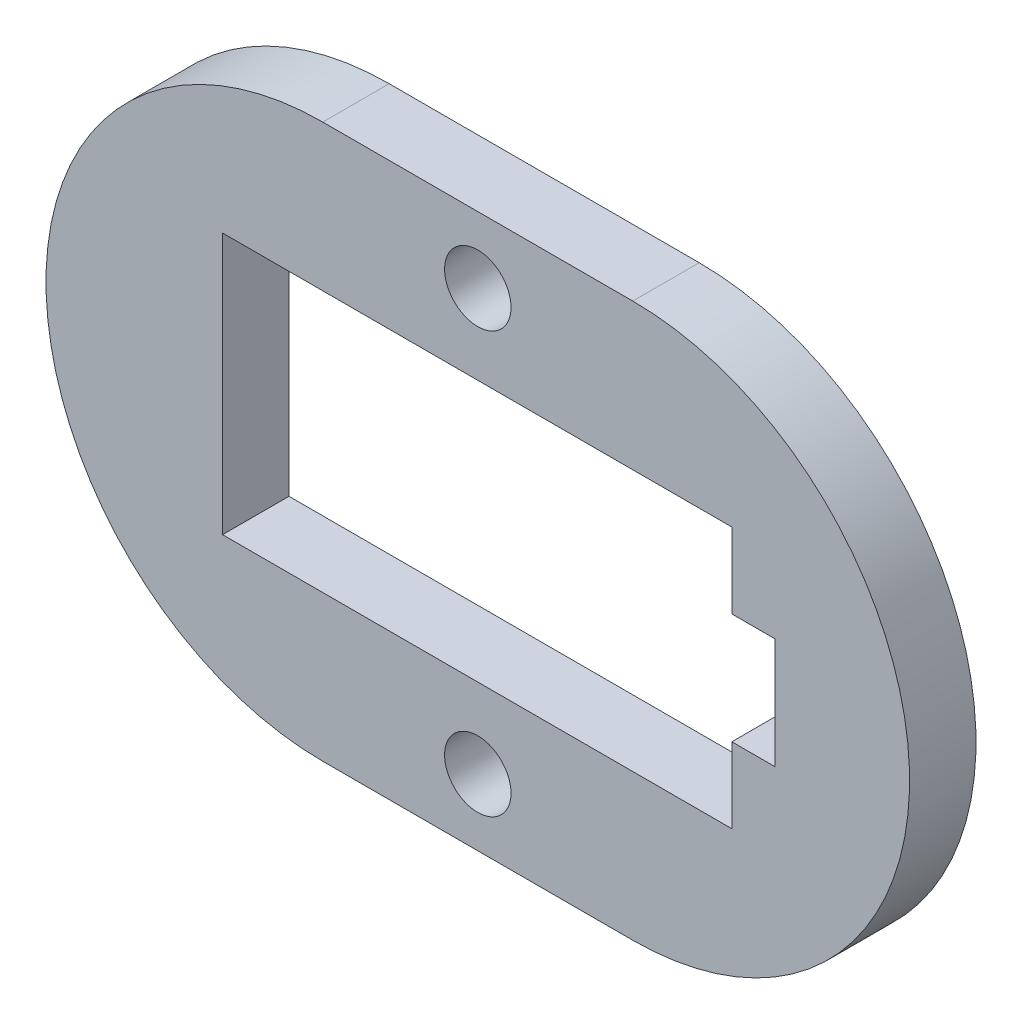
ISO-10303-21;
HEADER;
FILE_DESCRIPTION(('STEP AP214'),'2;1');
FILE_NAME('part.step','',(''),(''),'','','');
FILE_SCHEMA(('AUTOMOTIVE_DESIGN { 1 0 10303 214 1 1 1 1 }'));
ENDSEC;
DATA;
#1=APPLICATION_CONTEXT('core data for automotive mechanical design processes');
#2=APPLICATION_PROTOCOL_DEFINITION('international standard','automotive_design',2000,#1);
#3=PRODUCT_CONTEXT('',#1,'mechanical');
#4=PRODUCT('Part','Part','',(#3));
#5=PRODUCT_RELATED_PRODUCT_CATEGORY('part','',(#4));
#6=PRODUCT_DEFINITION_FORMATION('','',#4);
#7=PRODUCT_DEFINITION_CONTEXT('part definition',#1,'design');
#8=PRODUCT_DEFINITION('design','',#6,#7);
#9=PRODUCT_DEFINITION_SHAPE('','',#8);
#10=(LENGTH_UNIT() NAMED_UNIT(*) SI_UNIT(.MILLI.,.METRE.));
#11=(NAMED_UNIT(*) PLANE_ANGLE_UNIT() SI_UNIT($,.RADIAN.));
#12=(NAMED_UNIT(*) SI_UNIT($,.STERADIAN.) SOLID_ANGLE_UNIT());
#13=UNCERTAINTY_MEASURE_WITH_UNIT(LENGTH_MEASURE(1.E-05),#10,'distance_accuracy_value','');
#14=(GEOMETRIC_REPRESENTATION_CONTEXT(3) GLOBAL_UNCERTAINTY_ASSIGNED_CONTEXT((#13)) GLOBAL_UNIT_ASSIGNED_CONTEXT((#10,
#11,#12)) REPRESENTATION_CONTEXT('',''));
#15=CARTESIAN_POINT('',(0.,0.,0.));
#16=DIRECTION('',(0.,0.,1.));
#17=DIRECTION('',(1.,0.,0.));
#18=AXIS2_PLACEMENT_3D('',#15,#16,#17);
#19=CARTESIAN_POINT('',(4.52665068076197,5.9,3.));
#20=DIRECTION('',(0.,0.,1.));
#21=DIRECTION('',(1.,0.,0.));
#22=AXIS2_PLACEMENT_3D('',#19,#20,#21);
#23=PLANE('',#22);
#24=CARTESIAN_POINT('',(11.526650680762,15.4,3.));
#25=DIRECTION('',(0.,0.,1.));
#26=DIRECTION('',(1.,0.,0.));
#27=AXIS2_PLACEMENT_3D('',#24,#25,#26);
#28=CIRCLE('',#27,1.5);
#29=CARTESIAN_POINT('',(13.026650680762,15.4,3.));
#30=VERTEX_POINT('',#29);
#31=EDGE_CURVE('E161',#30,#30,#28,.T.);
#32=ORIENTED_EDGE('',*,*,#31,.F.);
#33=EDGE_LOOP('',(#32));
#34=FACE_BOUND('',#33,.T.);
#35=CARTESIAN_POINT('',(4.52665068076197,5.9,3.));
#36=DIRECTION('',(0.,0.,1.));
#37=DIRECTION('',(1.,0.,0.));
#38=AXIS2_PLACEMENT_3D('',#35,#36,#37);
#39=CIRCLE('',#38,12.5);
#40=CARTESIAN_POINT('',(4.52665068076197,18.4,3.));
#41=VERTEX_POINT('',#40);
#42=CARTESIAN_POINT('',(4.52665068076197,-6.6,3.));
#43=VERTEX_POINT('',#42);
#44=EDGE_CURVE('E191',#41,#43,#39,.T.);
#45=ORIENTED_EDGE('',*,*,#44,.T.);
#46=DIRECTION('',(1.,0.,0.));
#47=VECTOR('',#46,1.);
#48=CARTESIAN_POINT('',(4.52665068076197,-6.6,3.));
#49=LINE('',#48,#47);
#50=CARTESIAN_POINT('',(18.526650680762,-6.6,3.));
#51=VERTEX_POINT('',#50);
#52=EDGE_CURVE('E194',#43,#51,#49,.T.);
#53=ORIENTED_EDGE('',*,*,#52,.T.);
#54=CARTESIAN_POINT('',(18.526650680762,5.9,3.));
#55=DIRECTION('',(0.,0.,1.));
#56=DIRECTION('',(1.,0.,0.));
#57=AXIS2_PLACEMENT_3D('',#54,#55,#56);
#58=CIRCLE('',#57,12.5);
#59=CARTESIAN_POINT('',(18.526650680762,18.4,3.));
#60=VERTEX_POINT('',#59);
#61=EDGE_CURVE('E197',#51,#60,#58,.T.);
#62=ORIENTED_EDGE('',*,*,#61,.T.);
#63=DIRECTION('',(-1.,0.,0.));
#64=VECTOR('',#63,1.);
#65=CARTESIAN_POINT('',(4.52665068076197,18.4,3.));
#66=LINE('',#65,#64);
#67=EDGE_CURVE('E199',#60,#41,#66,.T.);
#68=ORIENTED_EDGE('',*,*,#67,.T.);
#69=EDGE_LOOP('',(#45,#53,#62,#68));
#70=FACE_BOUND('',#69,.T.);
#71=DIRECTION('',(0.,1.,0.));
#72=VECTOR('',#71,1.);
#73=CARTESIAN_POINT('',(23.,0.,3.));
#74=LINE('',#73,#72);
#75=CARTESIAN_POINT('',(23.,0.,3.));
#76=VERTEX_POINT('',#75);
#77=CARTESIAN_POINT('',(23.,3.4,3.));
#78=VERTEX_POINT('',#77);
#79=EDGE_CURVE('E131',#76,#78,#74,.T.);
#80=ORIENTED_EDGE('',*,*,#79,.F.);
#81=DIRECTION('',(1.,0.,0.));
#82=VECTOR('',#81,1.);
#83=CARTESIAN_POINT('',(0.,0.,3.));
#84=LINE('',#83,#82);
#85=CARTESIAN_POINT('',(0.,0.,3.));
#86=VERTEX_POINT('',#85);
#87=EDGE_CURVE('E123',#86,#76,#84,.T.);
#88=ORIENTED_EDGE('',*,*,#87,.F.);
#89=DIRECTION('',(0.,-1.,0.));
#90=VECTOR('',#89,1.);
#91=CARTESIAN_POINT('',(0.,0.,3.));
#92=LINE('',#91,#90);
#93=CARTESIAN_POINT('',(0.,11.8,3.));
#94=VERTEX_POINT('',#93);
#95=EDGE_CURVE('E158',#94,#86,#92,.T.);
#96=ORIENTED_EDGE('',*,*,#95,.F.);
#97=DIRECTION('',(-1.,0.,0.));
#98=VECTOR('',#97,1.);
#99=CARTESIAN_POINT('',(0.,11.8,3.));
#100=LINE('',#99,#98);
#101=CARTESIAN_POINT('',(23.,11.8,3.));
#102=VERTEX_POINT('',#101);
#103=EDGE_CURVE('E156',#102,#94,#100,.T.);
#104=ORIENTED_EDGE('',*,*,#103,.F.);
#105=DIRECTION('',(0.,1.,0.));
#106=VECTOR('',#105,1.);
#107=CARTESIAN_POINT('',(23.,8.4,3.));
#108=LINE('',#107,#106);
#109=CARTESIAN_POINT('',(23.,8.4,3.));
#110=VERTEX_POINT('',#109);
#111=EDGE_CURVE('E154',#110,#102,#108,.T.);
#112=ORIENTED_EDGE('',*,*,#111,.F.);
#113=DIRECTION('',(-1.,0.,0.));
#114=VECTOR('',#113,1.);
#115=CARTESIAN_POINT('',(24.9402576736917,8.4,3.));
#116=LINE('',#115,#114);
#117=CARTESIAN_POINT('',(24.9402576736917,8.4,3.));
#118=VERTEX_POINT('',#117);
#119=EDGE_CURVE('E152',#118,#110,#116,.T.);
#120=ORIENTED_EDGE('',*,*,#119,.F.);
#121=DIRECTION('',(0.,1.,0.));
#122=VECTOR('',#121,1.);
#123=CARTESIAN_POINT('',(24.9402576736917,8.4,3.));
#124=LINE('',#123,#122);
#125=CARTESIAN_POINT('',(24.9402576736917,3.4,3.));
#126=VERTEX_POINT('',#125);
#127=EDGE_CURVE('E147',#126,#118,#124,.T.);
#128=ORIENTED_EDGE('',*,*,#127,.F.);
#129=DIRECTION('',(1.,0.,0.));
#130=VECTOR('',#129,1.);
#131=CARTESIAN_POINT('',(24.9402576736917,3.4,3.));
#132=LINE('',#131,#130);
#133=EDGE_CURVE('E145',#78,#126,#132,.T.);
#134=ORIENTED_EDGE('',*,*,#133,.F.);
#135=EDGE_LOOP('',(#80,#88,#96,#104,#112,#120,#128,#134));
#136=FACE_BOUND('',#135,.T.);
#137=CARTESIAN_POINT('',(11.526650680762,-3.6,3.));
#138=DIRECTION('',(0.,0.,1.));
#139=DIRECTION('',(1.,0.,0.));
#140=AXIS2_PLACEMENT_3D('',#137,#138,#139);
#141=CIRCLE('',#140,1.5);
#142=CARTESIAN_POINT('',(13.026650680762,-3.6,3.));
#143=VERTEX_POINT('',#142);
#144=EDGE_CURVE('E298',#143,#143,#141,.T.);
#145=ORIENTED_EDGE('',*,*,#144,.F.);
#146=EDGE_LOOP('',(#145));
#147=FACE_BOUND('',#146,.T.);
#148=ADVANCED_FACE('F34',(#34,#70,#136,#147),#23,.T.);
#149=CARTESIAN_POINT('',(4.52665068076197,5.9,0.));
#150=DIRECTION('',(0.,0.,1.));
#151=DIRECTION('',(1.,0.,0.));
#152=AXIS2_PLACEMENT_3D('',#149,#150,#151);
#153=PLANE('',#152);
#154=CARTESIAN_POINT('',(11.526650680762,15.4,0.));
#155=DIRECTION('',(0.,0.,1.));
#156=DIRECTION('',(1.,0.,0.));
#157=AXIS2_PLACEMENT_3D('',#154,#155,#156);
#158=CIRCLE('',#157,1.5);
#159=CARTESIAN_POINT('',(13.026650680762,15.4,0.));
#160=VERTEX_POINT('',#159);
#161=EDGE_CURVE('E304',#160,#160,#158,.T.);
#162=ORIENTED_EDGE('',*,*,#161,.T.);
#163=EDGE_LOOP('',(#162));
#164=FACE_BOUND('',#163,.T.);
#165=CARTESIAN_POINT('',(4.52665068076197,5.9,0.));
#166=DIRECTION('',(0.,0.,1.));
#167=DIRECTION('',(1.,0.,0.));
#168=AXIS2_PLACEMENT_3D('',#165,#166,#167);
#169=CIRCLE('',#168,12.5);
#170=CARTESIAN_POINT('',(4.52665068076197,18.4,0.));
#171=VERTEX_POINT('',#170);
#172=CARTESIAN_POINT('',(4.52665068076197,-6.6,0.));
#173=VERTEX_POINT('',#172);
#174=EDGE_CURVE('E139',#171,#173,#169,.T.);
#175=ORIENTED_EDGE('',*,*,#174,.F.);
#176=DIRECTION('',(-1.,0.,0.));
#177=VECTOR('',#176,1.);
#178=CARTESIAN_POINT('',(4.52665068076197,18.4,0.));
#179=LINE('',#178,#177);
#180=CARTESIAN_POINT('',(18.526650680762,18.4,0.));
#181=VERTEX_POINT('',#180);
#182=EDGE_CURVE('E195',#181,#171,#179,.T.);
#183=ORIENTED_EDGE('',*,*,#182,.F.);
#184=CARTESIAN_POINT('',(18.526650680762,5.9,0.));
#185=DIRECTION('',(0.,0.,1.));
#186=DIRECTION('',(1.,0.,0.));
#187=AXIS2_PLACEMENT_3D('',#184,#185,#186);
#188=CIRCLE('',#187,12.5);
#189=CARTESIAN_POINT('',(18.526650680762,-6.6,0.));
#190=VERTEX_POINT('',#189);
#191=EDGE_CURVE('E206',#190,#181,#188,.T.);
#192=ORIENTED_EDGE('',*,*,#191,.F.);
#193=DIRECTION('',(1.,0.,0.));
#194=VECTOR('',#193,1.);
#195=CARTESIAN_POINT('',(4.52665068076197,-6.6,0.));
#196=LINE('',#195,#194);
#197=EDGE_CURVE('E204',#173,#190,#196,.T.);
#198=ORIENTED_EDGE('',*,*,#197,.F.);
#199=EDGE_LOOP('',(#175,#183,#192,#198));
#200=FACE_BOUND('',#199,.T.);
#201=DIRECTION('',(1.,0.,0.));
#202=VECTOR('',#201,1.);
#203=CARTESIAN_POINT('',(0.,0.,0.));
#204=LINE('',#203,#202);
#205=CARTESIAN_POINT('',(0.,0.,0.));
#206=VERTEX_POINT('',#205);
#207=CARTESIAN_POINT('',(23.,0.,0.));
#208=VERTEX_POINT('',#207);
#209=EDGE_CURVE('E57',#206,#208,#204,.T.);
#210=ORIENTED_EDGE('',*,*,#209,.T.);
#211=DIRECTION('',(0.,1.,0.));
#212=VECTOR('',#211,1.);
#213=CARTESIAN_POINT('',(23.,0.,0.));
#214=LINE('',#213,#212);
#215=CARTESIAN_POINT('',(23.,3.4,0.));
#216=VERTEX_POINT('',#215);
#217=EDGE_CURVE('E138',#208,#216,#214,.T.);
#218=ORIENTED_EDGE('',*,*,#217,.T.);
#219=DIRECTION('',(1.,0.,0.));
#220=VECTOR('',#219,1.);
#221=CARTESIAN_POINT('',(24.9402576736917,3.4,0.));
#222=LINE('',#221,#220);
#223=CARTESIAN_POINT('',(24.9402576736917,3.4,0.));
#224=VERTEX_POINT('',#223);
#225=EDGE_CURVE('E163',#216,#224,#222,.T.);
#226=ORIENTED_EDGE('',*,*,#225,.T.);
#227=DIRECTION('',(0.,1.,0.));
#228=VECTOR('',#227,1.);
#229=CARTESIAN_POINT('',(24.9402576736917,8.4,0.));
#230=LINE('',#229,#228);
#231=CARTESIAN_POINT('',(24.9402576736917,8.4,0.));
#232=VERTEX_POINT('',#231);
#233=EDGE_CURVE('E166',#224,#232,#230,.T.);
#234=ORIENTED_EDGE('',*,*,#233,.T.);
#235=DIRECTION('',(-1.,0.,0.));
#236=VECTOR('',#235,1.);
#237=CARTESIAN_POINT('',(24.9402576736917,8.4,0.));
#238=LINE('',#237,#236);
#239=CARTESIAN_POINT('',(23.,8.4,0.));
#240=VERTEX_POINT('',#239);
#241=EDGE_CURVE('E169',#232,#240,#238,.T.);
#242=ORIENTED_EDGE('',*,*,#241,.T.);
#243=DIRECTION('',(0.,1.,0.));
#244=VECTOR('',#243,1.);
#245=CARTESIAN_POINT('',(23.,8.4,0.));
#246=LINE('',#245,#244);
#247=CARTESIAN_POINT('',(23.,11.8,0.));
#248=VERTEX_POINT('',#247);
#249=EDGE_CURVE('E172',#240,#248,#246,.T.);
#250=ORIENTED_EDGE('',*,*,#249,.T.);
#251=DIRECTION('',(-1.,0.,0.));
#252=VECTOR('',#251,1.);
#253=CARTESIAN_POINT('',(0.,11.8,0.));
#254=LINE('',#253,#252);
#255=CARTESIAN_POINT('',(0.,11.8,0.));
#256=VERTEX_POINT('',#255);
#257=EDGE_CURVE('E175',#248,#256,#254,.T.);
#258=ORIENTED_EDGE('',*,*,#257,.T.);
#259=DIRECTION('',(0.,-1.,0.));
#260=VECTOR('',#259,1.);
#261=CARTESIAN_POINT('',(0.,0.,0.));
#262=LINE('',#261,#260);
#263=EDGE_CURVE('E132',#256,#206,#262,.T.);
#264=ORIENTED_EDGE('',*,*,#263,.T.);
#265=EDGE_LOOP('',(#210,#218,#226,#234,#242,#250,#258,#264));
#266=FACE_BOUND('',#265,.T.);
#267=CARTESIAN_POINT('',(11.526650680762,-3.6,0.));
#268=DIRECTION('',(0.,0.,1.));
#269=DIRECTION('',(1.,0.,0.));
#270=AXIS2_PLACEMENT_3D('',#267,#268,#269);
#271=CIRCLE('',#270,1.5);
#272=CARTESIAN_POINT('',(13.026650680762,-3.6,0.));
#273=VERTEX_POINT('',#272);
#274=EDGE_CURVE('E301',#273,#273,#271,.T.);
#275=ORIENTED_EDGE('',*,*,#274,.T.);
#276=EDGE_LOOP('',(#275));
#277=FACE_BOUND('',#276,.T.);
#278=ADVANCED_FACE('F224',(#164,#200,#266,#277),#153,.F.);
#279=CARTESIAN_POINT('',(4.52665068076197,5.9,3.));
#280=DIRECTION('',(0.,0.,-1.));
#281=DIRECTION('',(-1.,0.,0.));
#282=AXIS2_PLACEMENT_3D('',#279,#280,#281);
#283=CYLINDRICAL_SURFACE('',#282,12.5);
#284=ORIENTED_EDGE('',*,*,#174,.T.);
#285=DIRECTION('',(0.,0.,-1.));
#286=VECTOR('',#285,1.);
#287=CARTESIAN_POINT('',(4.52665068076197,-6.6,3.));
#288=LINE('',#287,#286);
#289=EDGE_CURVE('E11',#43,#173,#288,.T.);
#290=ORIENTED_EDGE('',*,*,#289,.F.);
#291=ORIENTED_EDGE('',*,*,#44,.F.);
#292=DIRECTION('',(0.,0.,-1.));
#293=VECTOR('',#292,1.);
#294=CARTESIAN_POINT('',(4.52665068076197,18.4,3.));
#295=LINE('',#294,#293);
#296=EDGE_CURVE('E201',#41,#171,#295,.T.);
#297=ORIENTED_EDGE('',*,*,#296,.T.);
#298=EDGE_LOOP('',(#284,#290,#291,#297));
#299=FACE_BOUND('',#298,.T.);
#300=ADVANCED_FACE('F36',(#299),#283,.T.);
#301=CARTESIAN_POINT('',(4.52665068076197,-6.6,3.));
#302=DIRECTION('',(0.,1.,0.));
#303=DIRECTION('',(0.,0.,1.));
#304=AXIS2_PLACEMENT_3D('',#301,#302,#303);
#305=PLANE('',#304);
#306=ORIENTED_EDGE('',*,*,#197,.T.);
#307=DIRECTION('',(0.,0.,-1.));
#308=VECTOR('',#307,1.);
#309=CARTESIAN_POINT('',(18.526650680762,-6.6,3.));
#310=LINE('',#309,#308);
#311=EDGE_CURVE('E42',#51,#190,#310,.T.);
#312=ORIENTED_EDGE('',*,*,#311,.F.);
#313=ORIENTED_EDGE('',*,*,#52,.F.);
#314=ORIENTED_EDGE('',*,*,#289,.T.);
#315=EDGE_LOOP('',(#306,#312,#313,#314));
#316=FACE_BOUND('',#315,.T.);
#317=ADVANCED_FACE('F234',(#316),#305,.F.);
#318=CARTESIAN_POINT('',(18.526650680762,5.9,3.));
#319=DIRECTION('',(0.,0.,-1.));
#320=DIRECTION('',(-1.,0.,0.));
#321=AXIS2_PLACEMENT_3D('',#318,#319,#320);
#322=CYLINDRICAL_SURFACE('',#321,12.5);
#323=ORIENTED_EDGE('',*,*,#191,.T.);
#324=DIRECTION('',(0.,0.,-1.));
#325=VECTOR('',#324,1.);
#326=CARTESIAN_POINT('',(18.526650680762,18.4,3.));
#327=LINE('',#326,#325);
#328=EDGE_CURVE('E211',#60,#181,#327,.T.);
#329=ORIENTED_EDGE('',*,*,#328,.F.);
#330=ORIENTED_EDGE('',*,*,#61,.F.);
#331=ORIENTED_EDGE('',*,*,#311,.T.);
#332=EDGE_LOOP('',(#323,#329,#330,#331));
#333=FACE_BOUND('',#332,.T.);
#334=ADVANCED_FACE('F218',(#333),#322,.T.);
#335=CARTESIAN_POINT('',(4.52665068076197,18.4,3.));
#336=DIRECTION('',(0.,-1.,0.));
#337=DIRECTION('',(0.,0.,-1.));
#338=AXIS2_PLACEMENT_3D('',#335,#336,#337);
#339=PLANE('',#338);
#340=ORIENTED_EDGE('',*,*,#182,.T.);
#341=ORIENTED_EDGE('',*,*,#296,.F.);
#342=ORIENTED_EDGE('',*,*,#67,.F.);
#343=ORIENTED_EDGE('',*,*,#328,.T.);
#344=EDGE_LOOP('',(#340,#341,#342,#343));
#345=FACE_BOUND('',#344,.T.);
#346=ADVANCED_FACE('F228',(#345),#339,.F.);
#347=CARTESIAN_POINT('',(0.,0.,3.));
#348=DIRECTION('',(0.,1.,0.));
#349=DIRECTION('',(0.,0.,1.));
#350=AXIS2_PLACEMENT_3D('',#347,#348,#349);
#351=PLANE('',#350);
#352=ORIENTED_EDGE('',*,*,#209,.F.);
#353=DIRECTION('',(0.,0.,-1.));
#354=VECTOR('',#353,1.);
#355=CARTESIAN_POINT('',(0.,0.,3.));
#356=LINE('',#355,#354);
#357=EDGE_CURVE('E127',#86,#206,#356,.T.);
#358=ORIENTED_EDGE('',*,*,#357,.F.);
#359=ORIENTED_EDGE('',*,*,#87,.T.);
#360=DIRECTION('',(0.,0.,-1.));
#361=VECTOR('',#360,1.);
#362=CARTESIAN_POINT('',(23.,0.,3.));
#363=LINE('',#362,#361);
#364=EDGE_CURVE('E126',#76,#208,#363,.T.);
#365=ORIENTED_EDGE('',*,*,#364,.T.);
#366=EDGE_LOOP('',(#352,#358,#359,#365));
#367=FACE_BOUND('',#366,.T.);
#368=ADVANCED_FACE('F125',(#367),#351,.T.);
#369=CARTESIAN_POINT('',(23.,0.,3.));
#370=DIRECTION('',(-1.,0.,0.));
#371=DIRECTION('',(0.,0.,1.));
#372=AXIS2_PLACEMENT_3D('',#369,#370,#371);
#373=PLANE('',#372);
#374=ORIENTED_EDGE('',*,*,#217,.F.);
#375=ORIENTED_EDGE('',*,*,#364,.F.);
#376=ORIENTED_EDGE('',*,*,#79,.T.);
#377=DIRECTION('',(0.,0.,-1.));
#378=VECTOR('',#377,1.);
#379=CARTESIAN_POINT('',(23.,3.4,3.));
#380=LINE('',#379,#378);
#381=EDGE_CURVE('E140',#78,#216,#380,.T.);
#382=ORIENTED_EDGE('',*,*,#381,.T.);
#383=EDGE_LOOP('',(#374,#375,#376,#382));
#384=FACE_BOUND('',#383,.T.);
#385=ADVANCED_FACE('F135',(#384),#373,.T.);
#386=CARTESIAN_POINT('',(24.9402576736917,3.4,3.));
#387=DIRECTION('',(0.,1.,0.));
#388=DIRECTION('',(-1.,0.,0.));
#389=AXIS2_PLACEMENT_3D('',#386,#387,#388);
#390=PLANE('',#389);
#391=ORIENTED_EDGE('',*,*,#225,.F.);
#392=ORIENTED_EDGE('',*,*,#381,.F.);
#393=ORIENTED_EDGE('',*,*,#133,.T.);
#394=DIRECTION('',(0.,0.,-1.));
#395=VECTOR('',#394,1.);
#396=CARTESIAN_POINT('',(24.9402576736917,3.4,3.));
#397=LINE('',#396,#395);
#398=EDGE_CURVE('E188',#126,#224,#397,.T.);
#399=ORIENTED_EDGE('',*,*,#398,.T.);
#400=EDGE_LOOP('',(#391,#392,#393,#399));
#401=FACE_BOUND('',#400,.T.);
#402=ADVANCED_FACE('F260',(#401),#390,.T.);
#403=CARTESIAN_POINT('',(24.9402576736917,8.4,3.));
#404=DIRECTION('',(-1.,0.,0.));
#405=DIRECTION('',(0.,0.,1.));
#406=AXIS2_PLACEMENT_3D('',#403,#404,#405);
#407=PLANE('',#406);
#408=ORIENTED_EDGE('',*,*,#233,.F.);
#409=ORIENTED_EDGE('',*,*,#398,.F.);
#410=ORIENTED_EDGE('',*,*,#127,.T.);
#411=DIRECTION('',(0.,0.,-1.));
#412=VECTOR('',#411,1.);
#413=CARTESIAN_POINT('',(24.9402576736917,8.4,3.));
#414=LINE('',#413,#412);
#415=EDGE_CURVE('E186',#118,#232,#414,.T.);
#416=ORIENTED_EDGE('',*,*,#415,.T.);
#417=EDGE_LOOP('',(#408,#409,#410,#416));
#418=FACE_BOUND('',#417,.T.);
#419=ADVANCED_FACE('F264',(#418),#407,.T.);
#420=CARTESIAN_POINT('',(24.9402576736917,8.4,3.));
#421=DIRECTION('',(0.,-1.,0.));
#422=DIRECTION('',(0.,0.,-1.));
#423=AXIS2_PLACEMENT_3D('',#420,#421,#422);
#424=PLANE('',#423);
#425=ORIENTED_EDGE('',*,*,#241,.F.);
#426=ORIENTED_EDGE('',*,*,#415,.F.);
#427=ORIENTED_EDGE('',*,*,#119,.T.);
#428=DIRECTION('',(0.,0.,-1.));
#429=VECTOR('',#428,1.);
#430=CARTESIAN_POINT('',(23.,8.4,3.));
#431=LINE('',#430,#429);
#432=EDGE_CURVE('E184',#110,#240,#431,.T.);
#433=ORIENTED_EDGE('',*,*,#432,.T.);
#434=EDGE_LOOP('',(#425,#426,#427,#433));
#435=FACE_BOUND('',#434,.T.);
#436=ADVANCED_FACE('F270',(#435),#424,.T.);
#437=CARTESIAN_POINT('',(23.,8.4,3.));
#438=DIRECTION('',(-1.,0.,0.));
#439=DIRECTION('',(0.,0.,1.));
#440=AXIS2_PLACEMENT_3D('',#437,#438,#439);
#441=PLANE('',#440);
#442=ORIENTED_EDGE('',*,*,#249,.F.);
#443=ORIENTED_EDGE('',*,*,#432,.F.);
#444=ORIENTED_EDGE('',*,*,#111,.T.);
#445=DIRECTION('',(0.,0.,-1.));
#446=VECTOR('',#445,1.);
#447=CARTESIAN_POINT('',(23.,11.8,3.));
#448=LINE('',#447,#446);
#449=EDGE_CURVE('E182',#102,#248,#448,.T.);
#450=ORIENTED_EDGE('',*,*,#449,.T.);
#451=EDGE_LOOP('',(#442,#443,#444,#450));
#452=FACE_BOUND('',#451,.T.);
#453=ADVANCED_FACE('F274',(#452),#441,.T.);
#454=CARTESIAN_POINT('',(0.,11.8,3.));
#455=DIRECTION('',(0.,-1.,0.));
#456=DIRECTION('',(0.,0.,-1.));
#457=AXIS2_PLACEMENT_3D('',#454,#455,#456);
#458=PLANE('',#457);
#459=ORIENTED_EDGE('',*,*,#257,.F.);
#460=ORIENTED_EDGE('',*,*,#449,.F.);
#461=ORIENTED_EDGE('',*,*,#103,.T.);
#462=DIRECTION('',(0.,0.,-1.));
#463=VECTOR('',#462,1.);
#464=CARTESIAN_POINT('',(0.,11.8,3.));
#465=LINE('',#464,#463);
#466=EDGE_CURVE('E49',#94,#256,#465,.T.);
#467=ORIENTED_EDGE('',*,*,#466,.T.);
#468=EDGE_LOOP('',(#459,#460,#461,#467));
#469=FACE_BOUND('',#468,.T.);
#470=ADVANCED_FACE('F278',(#469),#458,.T.);
#471=CARTESIAN_POINT('',(0.,0.,3.));
#472=DIRECTION('',(1.,0.,0.));
#473=DIRECTION('',(0.,0.,-1.));
#474=AXIS2_PLACEMENT_3D('',#471,#472,#473);
#475=PLANE('',#474);
#476=ORIENTED_EDGE('',*,*,#263,.F.);
#477=ORIENTED_EDGE('',*,*,#466,.F.);
#478=ORIENTED_EDGE('',*,*,#95,.T.);
#479=ORIENTED_EDGE('',*,*,#357,.T.);
#480=EDGE_LOOP('',(#476,#477,#478,#479));
#481=FACE_BOUND('',#480,.T.);
#482=ADVANCED_FACE('F282',(#481),#475,.T.);
#483=CARTESIAN_POINT('',(11.526650680762,15.4,3.));
#484=DIRECTION('',(0.,0.,-1.));
#485=DIRECTION('',(-1.,0.,0.));
#486=AXIS2_PLACEMENT_3D('',#483,#484,#485);
#487=CYLINDRICAL_SURFACE('',#486,1.5);
#488=ORIENTED_EDGE('',*,*,#31,.T.);
#489=EDGE_LOOP('',(#488));
#490=FACE_BOUND('',#489,.T.);
#491=ORIENTED_EDGE('',*,*,#161,.F.);
#492=EDGE_LOOP('',(#491));
#493=FACE_BOUND('',#492,.T.);
#494=ADVANCED_FACE('F286',(#490,#493),#487,.F.);
#495=CARTESIAN_POINT('',(11.526650680762,-3.6,3.));
#496=DIRECTION('',(0.,0.,-1.));
#497=DIRECTION('',(-1.,0.,0.));
#498=AXIS2_PLACEMENT_3D('',#495,#496,#497);
#499=CYLINDRICAL_SURFACE('',#498,1.5);
#500=ORIENTED_EDGE('',*,*,#144,.T.);
#501=EDGE_LOOP('',(#500));
#502=FACE_BOUND('',#501,.T.);
#503=ORIENTED_EDGE('',*,*,#274,.F.);
#504=EDGE_LOOP('',(#503));
#505=FACE_BOUND('',#504,.T.);
#506=ADVANCED_FACE('F289',(#502,#505),#499,.F.);
#507=CLOSED_SHELL('',(#148,#278,#300,#317,#334,#346,#368,#385,#402,#419,#436,#453,#470,#482,
#494,#506));
#508=MANIFOLD_SOLID_BREP('B2',#507);
#509=ADVANCED_BREP_SHAPE_REPRESENTATION('',(#18,#508),#14);
#510=SHAPE_DEFINITION_REPRESENTATION(#9,#509);
ENDSEC;
END-ISO-10303-21;
